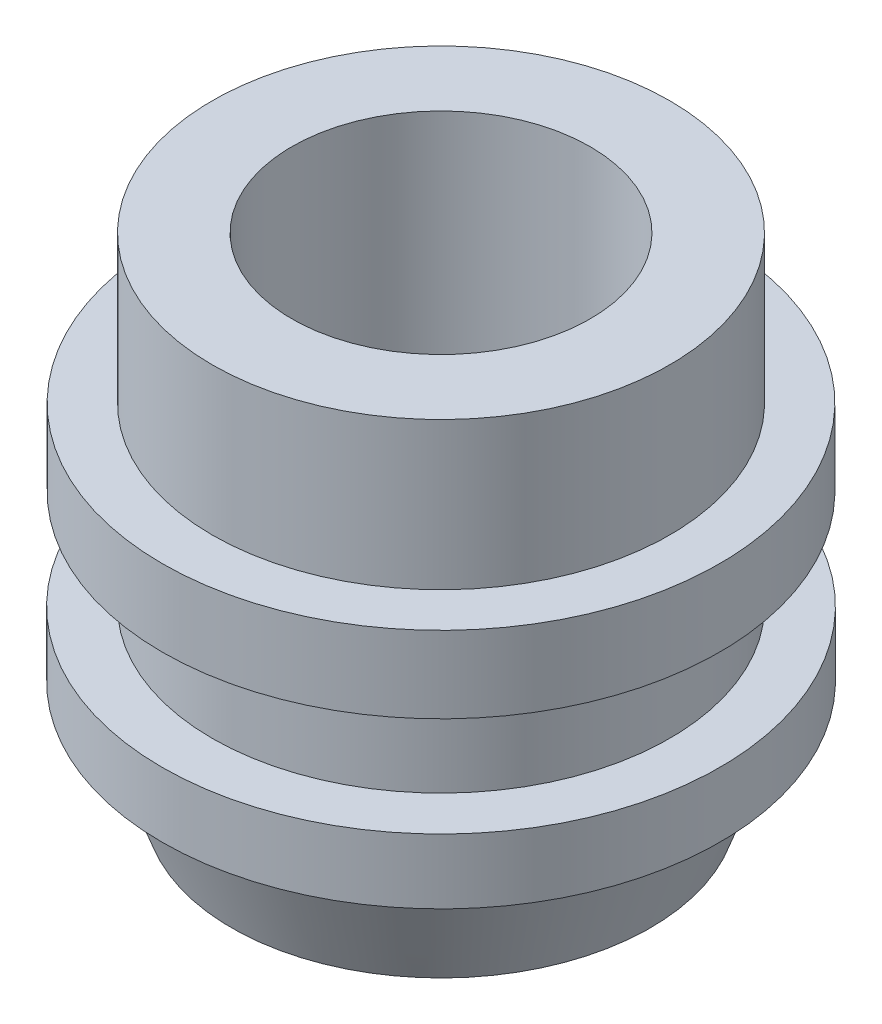
ISO-10303-21;
HEADER;
FILE_DESCRIPTION(('STEP AP214'),'2;1');
FILE_NAME('part.step','',(''),(''),'','','');
FILE_SCHEMA(('AUTOMOTIVE_DESIGN { 1 0 10303 214 1 1 1 1 }'));
ENDSEC;
DATA;
#1=APPLICATION_CONTEXT('core data for automotive mechanical design processes');
#2=APPLICATION_PROTOCOL_DEFINITION('international standard','automotive_design',2000,#1);
#3=PRODUCT_CONTEXT('',#1,'mechanical');
#4=PRODUCT('Part','Part','',(#3));
#5=PRODUCT_RELATED_PRODUCT_CATEGORY('part','',(#4));
#6=PRODUCT_DEFINITION_FORMATION('','',#4);
#7=PRODUCT_DEFINITION_CONTEXT('part definition',#1,'design');
#8=PRODUCT_DEFINITION('design','',#6,#7);
#9=PRODUCT_DEFINITION_SHAPE('','',#8);
#10=(LENGTH_UNIT() NAMED_UNIT(*) SI_UNIT(.MILLI.,.METRE.));
#11=(NAMED_UNIT(*) PLANE_ANGLE_UNIT() SI_UNIT($,.RADIAN.));
#12=(NAMED_UNIT(*) SI_UNIT($,.STERADIAN.) SOLID_ANGLE_UNIT());
#13=UNCERTAINTY_MEASURE_WITH_UNIT(LENGTH_MEASURE(1.E-05),#10,'distance_accuracy_value','');
#14=(GEOMETRIC_REPRESENTATION_CONTEXT(3) GLOBAL_UNCERTAINTY_ASSIGNED_CONTEXT((#13)) GLOBAL_UNIT_ASSIGNED_CONTEXT((#10,
#11,#12)) REPRESENTATION_CONTEXT('',''));
#15=CARTESIAN_POINT('',(0.,0.,0.));
#16=DIRECTION('',(0.,0.,1.));
#17=DIRECTION('',(1.,0.,0.));
#18=AXIS2_PLACEMENT_3D('',#15,#16,#17);
#19=CARTESIAN_POINT('',(0.,-0.19624745399949,-2.10519254252484));
#20=DIRECTION('',(0.,-1.,0.));
#21=DIRECTION('',(0.,0.,-1.));
#22=AXIS2_PLACEMENT_3D('',#19,#20,#21);
#23=PLANE('',#22);
#24=CARTESIAN_POINT('',(0.,-0.19624745399949,0.));
#25=DIRECTION('',(0.,-1.,0.));
#26=DIRECTION('',(0.,0.,-1.));
#27=AXIS2_PLACEMENT_3D('',#24,#25,#26);
#28=CIRCLE('',#27,2.10519254252484);
#29=CARTESIAN_POINT('',(0.,-0.19624745399949,-2.10519254252484));
#30=VERTEX_POINT('',#29);
#31=EDGE_CURVE('E73',#30,#30,#28,.T.);
#32=ORIENTED_EDGE('',*,*,#31,.T.);
#33=EDGE_LOOP('',(#32));
#34=FACE_BOUND('',#33,.T.);
#35=CARTESIAN_POINT('',(0.,-0.19624745399949,0.));
#36=DIRECTION('',(0.,-1.,0.));
#37=DIRECTION('',(0.,0.,-1.));
#38=AXIS2_PLACEMENT_3D('',#35,#36,#37);
#39=CIRCLE('',#38,1.5);
#40=CARTESIAN_POINT('',(0.,-0.19624745399949,-1.5));
#41=VERTEX_POINT('',#40);
#42=EDGE_CURVE('E10',#41,#41,#39,.T.);
#43=ORIENTED_EDGE('',*,*,#42,.F.);
#44=EDGE_LOOP('',(#43));
#45=FACE_BOUND('',#44,.T.);
#46=ADVANCED_FACE('F33',(#34,#45),#23,.T.);
#47=CARTESIAN_POINT('',(0.,0.,0.));
#48=DIRECTION('',(0.,-1.,0.));
#49=DIRECTION('',(0.,0.,-1.));
#50=AXIS2_PLACEMENT_3D('',#47,#48,#49);
#51=CYLINDRICAL_SURFACE('',#50,1.5);
#52=ORIENTED_EDGE('',*,*,#42,.T.);
#53=EDGE_LOOP('',(#52));
#54=FACE_BOUND('',#53,.T.);
#55=CARTESIAN_POINT('',(0.,4.80375254600051,0.));
#56=DIRECTION('',(0.,-1.,0.));
#57=DIRECTION('',(0.,0.,-1.));
#58=AXIS2_PLACEMENT_3D('',#55,#56,#57);
#59=CIRCLE('',#58,1.5);
#60=CARTESIAN_POINT('',(0.,4.80375254600051,-1.5));
#61=VERTEX_POINT('',#60);
#62=EDGE_CURVE('E39',#61,#61,#59,.T.);
#63=ORIENTED_EDGE('',*,*,#62,.F.);
#64=EDGE_LOOP('',(#63));
#65=FACE_BOUND('',#64,.T.);
#66=ADVANCED_FACE('F91',(#54,#65),#51,.F.);
#67=CARTESIAN_POINT('',(0.,4.80375254600051,-1.5));
#68=DIRECTION('',(0.,1.,0.));
#69=DIRECTION('',(0.,0.,1.));
#70=AXIS2_PLACEMENT_3D('',#67,#68,#69);
#71=PLANE('',#70);
#72=ORIENTED_EDGE('',*,*,#62,.T.);
#73=EDGE_LOOP('',(#72));
#74=FACE_BOUND('',#73,.T.);
#75=CARTESIAN_POINT('',(0.,4.80375254600051,0.));
#76=DIRECTION('',(0.,-1.,0.));
#77=DIRECTION('',(0.,0.,-1.));
#78=AXIS2_PLACEMENT_3D('',#75,#76,#77);
#79=CIRCLE('',#78,2.3);
#80=CARTESIAN_POINT('',(0.,4.80375254600051,-2.3));
#81=VERTEX_POINT('',#80);
#82=EDGE_CURVE('E43',#81,#81,#79,.T.);
#83=ORIENTED_EDGE('',*,*,#82,.F.);
#84=EDGE_LOOP('',(#83));
#85=FACE_BOUND('',#84,.T.);
#86=ADVANCED_FACE('F95',(#74,#85),#71,.T.);
#87=CARTESIAN_POINT('',(0.,0.,0.));
#88=DIRECTION('',(0.,-1.,0.));
#89=DIRECTION('',(0.,0.,-1.));
#90=AXIS2_PLACEMENT_3D('',#87,#88,#89);
#91=CYLINDRICAL_SURFACE('',#90,2.3);
#92=ORIENTED_EDGE('',*,*,#82,.T.);
#93=EDGE_LOOP('',(#92));
#94=FACE_BOUND('',#93,.T.);
#95=CARTESIAN_POINT('',(0.,3.32183084791746,0.));
#96=DIRECTION('',(0.,-1.,0.));
#97=DIRECTION('',(0.,0.,-1.));
#98=AXIS2_PLACEMENT_3D('',#95,#96,#97);
#99=CIRCLE('',#98,2.3);
#100=CARTESIAN_POINT('',(0.,3.32183084791746,-2.3));
#101=VERTEX_POINT('',#100);
#102=EDGE_CURVE('E47',#101,#101,#99,.T.);
#103=ORIENTED_EDGE('',*,*,#102,.F.);
#104=EDGE_LOOP('',(#103));
#105=FACE_BOUND('',#104,.T.);
#106=ADVANCED_FACE('F99',(#94,#105),#91,.T.);
#107=CARTESIAN_POINT('',(0.,3.32183084791746,-2.3));
#108=DIRECTION('',(0.,1.,0.));
#109=DIRECTION('',(0.,0.,1.));
#110=AXIS2_PLACEMENT_3D('',#107,#108,#109);
#111=PLANE('',#110);
#112=ORIENTED_EDGE('',*,*,#102,.T.);
#113=EDGE_LOOP('',(#112));
#114=FACE_BOUND('',#113,.T.);
#115=CARTESIAN_POINT('',(0.,3.32183084791746,0.));
#116=DIRECTION('',(0.,-1.,0.));
#117=DIRECTION('',(0.,0.,-1.));
#118=AXIS2_PLACEMENT_3D('',#115,#116,#117);
#119=CIRCLE('',#118,2.8);
#120=CARTESIAN_POINT('',(0.,3.32183084791746,-2.8));
#121=VERTEX_POINT('',#120);
#122=EDGE_CURVE('E52',#121,#121,#119,.T.);
#123=ORIENTED_EDGE('',*,*,#122,.F.);
#124=EDGE_LOOP('',(#123));
#125=FACE_BOUND('',#124,.T.);
#126=ADVANCED_FACE('F105',(#114,#125),#111,.T.);
#127=CARTESIAN_POINT('',(0.,0.,0.));
#128=DIRECTION('',(0.,-1.,0.));
#129=DIRECTION('',(0.,0.,-1.));
#130=AXIS2_PLACEMENT_3D('',#127,#128,#129);
#131=CYLINDRICAL_SURFACE('',#130,2.8);
#132=ORIENTED_EDGE('',*,*,#122,.T.);
#133=EDGE_LOOP('',(#132));
#134=FACE_BOUND('',#133,.T.);
#135=CARTESIAN_POINT('',(0.,2.55123156491428,0.));
#136=DIRECTION('',(0.,-1.,0.));
#137=DIRECTION('',(0.,0.,-1.));
#138=AXIS2_PLACEMENT_3D('',#135,#136,#137);
#139=CIRCLE('',#138,2.8);
#140=CARTESIAN_POINT('',(0.,2.55123156491428,-2.8));
#141=VERTEX_POINT('',#140);
#142=EDGE_CURVE('E55',#141,#141,#139,.T.);
#143=ORIENTED_EDGE('',*,*,#142,.F.);
#144=EDGE_LOOP('',(#143));
#145=FACE_BOUND('',#144,.T.);
#146=ADVANCED_FACE('F109',(#134,#145),#131,.T.);
#147=CARTESIAN_POINT('',(0.,2.55123156491428,-2.8));
#148=DIRECTION('',(0.,-1.,0.));
#149=DIRECTION('',(0.,0.,-1.));
#150=AXIS2_PLACEMENT_3D('',#147,#148,#149);
#151=PLANE('',#150);
#152=ORIENTED_EDGE('',*,*,#142,.T.);
#153=EDGE_LOOP('',(#152));
#154=FACE_BOUND('',#153,.T.);
#155=CARTESIAN_POINT('',(0.,2.55123156491428,0.));
#156=DIRECTION('',(0.,-1.,0.));
#157=DIRECTION('',(0.,0.,-1.));
#158=AXIS2_PLACEMENT_3D('',#155,#156,#157);
#159=CIRCLE('',#158,2.3);
#160=CARTESIAN_POINT('',(0.,2.55123156491428,-2.3));
#161=VERTEX_POINT('',#160);
#162=EDGE_CURVE('E58',#161,#161,#159,.T.);
#163=ORIENTED_EDGE('',*,*,#162,.F.);
#164=EDGE_LOOP('',(#163));
#165=FACE_BOUND('',#164,.T.);
#166=ADVANCED_FACE('F113',(#154,#165),#151,.T.);
#167=CARTESIAN_POINT('',(0.,0.,0.));
#168=DIRECTION('',(0.,-1.,0.));
#169=DIRECTION('',(0.,0.,-1.));
#170=AXIS2_PLACEMENT_3D('',#167,#168,#169);
#171=CYLINDRICAL_SURFACE('',#170,2.3);
#172=ORIENTED_EDGE('',*,*,#162,.T.);
#173=EDGE_LOOP('',(#172));
#174=FACE_BOUND('',#173,.T.);
#175=CARTESIAN_POINT('',(0.,1.55123156491428,0.));
#176=DIRECTION('',(0.,-1.,0.));
#177=DIRECTION('',(0.,0.,-1.));
#178=AXIS2_PLACEMENT_3D('',#175,#176,#177);
#179=CIRCLE('',#178,2.3);
#180=CARTESIAN_POINT('',(0.,1.55123156491428,-2.3));
#181=VERTEX_POINT('',#180);
#182=EDGE_CURVE('E61',#181,#181,#179,.T.);
#183=ORIENTED_EDGE('',*,*,#182,.F.);
#184=EDGE_LOOP('',(#183));
#185=FACE_BOUND('',#184,.T.);
#186=ADVANCED_FACE('F117',(#174,#185),#171,.T.);
#187=CARTESIAN_POINT('',(0.,1.55123156491428,-2.3));
#188=DIRECTION('',(0.,1.,0.));
#189=DIRECTION('',(0.,0.,1.));
#190=AXIS2_PLACEMENT_3D('',#187,#188,#189);
#191=PLANE('',#190);
#192=ORIENTED_EDGE('',*,*,#182,.T.);
#193=EDGE_LOOP('',(#192));
#194=FACE_BOUND('',#193,.T.);
#195=CARTESIAN_POINT('',(0.,1.55123156491428,0.));
#196=DIRECTION('',(0.,-1.,0.));
#197=DIRECTION('',(0.,0.,-1.));
#198=AXIS2_PLACEMENT_3D('',#195,#196,#197);
#199=CIRCLE('',#198,2.80389771986335);
#200=CARTESIAN_POINT('',(0.,1.55123156491428,-2.80389771986335));
#201=VERTEX_POINT('',#200);
#202=EDGE_CURVE('E64',#201,#201,#199,.T.);
#203=ORIENTED_EDGE('',*,*,#202,.F.);
#204=EDGE_LOOP('',(#203));
#205=FACE_BOUND('',#204,.T.);
#206=ADVANCED_FACE('F121',(#194,#205),#191,.T.);
#207=CARTESIAN_POINT('',(0.,0.,0.));
#208=DIRECTION('',(0.,-1.,0.));
#209=DIRECTION('',(0.,0.,-1.));
#210=AXIS2_PLACEMENT_3D('',#207,#208,#209);
#211=CYLINDRICAL_SURFACE('',#210,2.80389771986335);
#212=ORIENTED_EDGE('',*,*,#202,.T.);
#213=EDGE_LOOP('',(#212));
#214=FACE_BOUND('',#213,.T.);
#215=CARTESIAN_POINT('',(0.,0.899186017757736,0.));
#216=DIRECTION('',(0.,-1.,0.));
#217=DIRECTION('',(0.,0.,-1.));
#218=AXIS2_PLACEMENT_3D('',#215,#216,#217);
#219=CIRCLE('',#218,2.80389771986335);
#220=CARTESIAN_POINT('',(0.,0.899186017757736,-2.80389771986335));
#221=VERTEX_POINT('',#220);
#222=EDGE_CURVE('E67',#221,#221,#219,.T.);
#223=ORIENTED_EDGE('',*,*,#222,.F.);
#224=EDGE_LOOP('',(#223));
#225=FACE_BOUND('',#224,.T.);
#226=ADVANCED_FACE('F87',(#214,#225),#211,.T.);
#227=CARTESIAN_POINT('',(0.,0.899186017757736,-2.80389771986335));
#228=DIRECTION('',(0.,-1.,0.));
#229=DIRECTION('',(0.,0.,-1.));
#230=AXIS2_PLACEMENT_3D('',#227,#228,#229);
#231=PLANE('',#230);
#232=ORIENTED_EDGE('',*,*,#222,.T.);
#233=EDGE_LOOP('',(#232));
#234=FACE_BOUND('',#233,.T.);
#235=CARTESIAN_POINT('',(0.,0.899186017757736,0.));
#236=DIRECTION('',(0.,-1.,0.));
#237=DIRECTION('',(0.,0.,-1.));
#238=AXIS2_PLACEMENT_3D('',#235,#236,#237);
#239=CIRCLE('',#238,2.50389771986335);
#240=CARTESIAN_POINT('',(0.,0.899186017757736,-2.50389771986335));
#241=VERTEX_POINT('',#240);
#242=EDGE_CURVE('E70',#241,#241,#239,.T.);
#243=ORIENTED_EDGE('',*,*,#242,.F.);
#244=EDGE_LOOP('',(#243));
#245=FACE_BOUND('',#244,.T.);
#246=ADVANCED_FACE('F81',(#234,#245),#231,.T.);
#247=CARTESIAN_POINT('',(0.,-0.19624745399949,0.));
#248=DIRECTION('',(0.,1.,0.));
#249=DIRECTION('',(0.,0.,1.));
#250=AXIS2_PLACEMENT_3D('',#247,#248,#249);
#251=CONICAL_SURFACE('',#250,2.10519254252484,0.34906585039886);
#252=ORIENTED_EDGE('',*,*,#242,.T.);
#253=EDGE_LOOP('',(#252));
#254=FACE_BOUND('',#253,.T.);
#255=ORIENTED_EDGE('',*,*,#31,.F.);
#256=EDGE_LOOP('',(#255));
#257=FACE_BOUND('',#256,.T.);
#258=ADVANCED_FACE('F79',(#254,#257),#251,.T.);
#259=CLOSED_SHELL('',(#46,#66,#86,#106,#126,#146,#166,#186,#206,#226,#246,#258));
#260=MANIFOLD_SOLID_BREP('B2',#259);
#261=ADVANCED_BREP_SHAPE_REPRESENTATION('',(#18,#260),#14);
#262=SHAPE_DEFINITION_REPRESENTATION(#9,#261);
ENDSEC;
END-ISO-10303-21;
